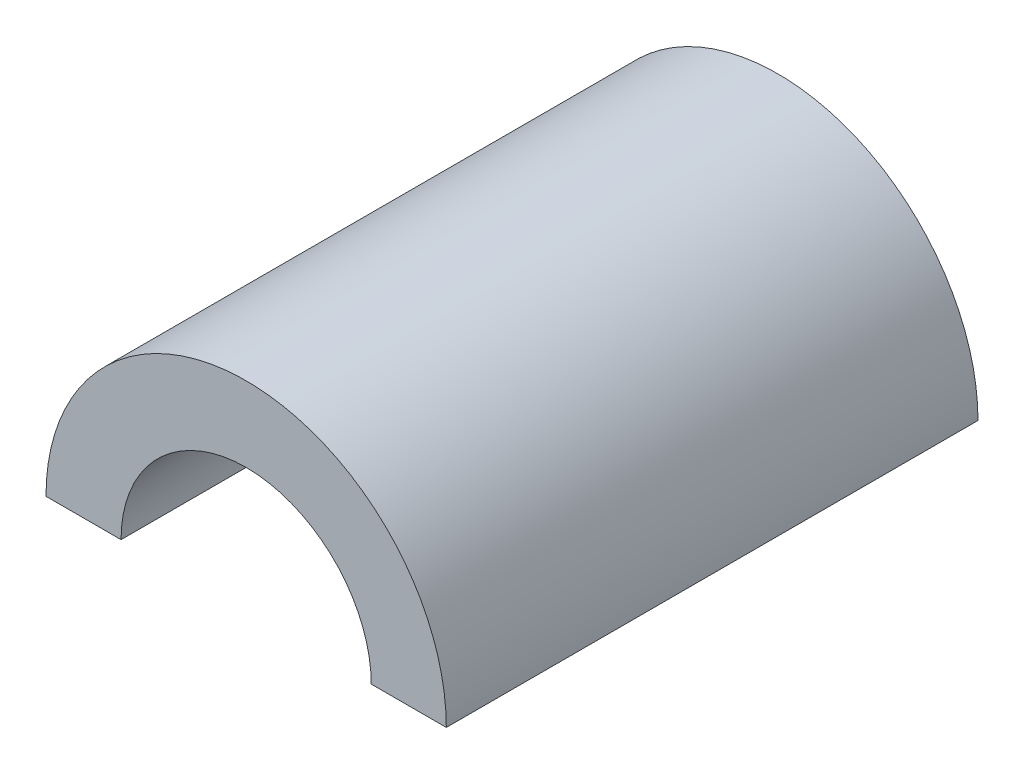
ISO-10303-21;
HEADER;
FILE_DESCRIPTION(('STEP AP214'),'2;1');
FILE_NAME('part.step','',(''),(''),'','','');
FILE_SCHEMA(('AUTOMOTIVE_DESIGN { 1 0 10303 214 1 1 1 1 }'));
ENDSEC;
DATA;
#1=APPLICATION_CONTEXT('core data for automotive mechanical design processes');
#2=APPLICATION_PROTOCOL_DEFINITION('international standard','automotive_design',2000,#1);
#3=PRODUCT_CONTEXT('',#1,'mechanical');
#4=PRODUCT('Part','Part','',(#3));
#5=PRODUCT_RELATED_PRODUCT_CATEGORY('part','',(#4));
#6=PRODUCT_DEFINITION_FORMATION('','',#4);
#7=PRODUCT_DEFINITION_CONTEXT('part definition',#1,'design');
#8=PRODUCT_DEFINITION('design','',#6,#7);
#9=PRODUCT_DEFINITION_SHAPE('','',#8);
#10=(LENGTH_UNIT() NAMED_UNIT(*) SI_UNIT(.MILLI.,.METRE.));
#11=(NAMED_UNIT(*) PLANE_ANGLE_UNIT() SI_UNIT($,.RADIAN.));
#12=(NAMED_UNIT(*) SI_UNIT($,.STERADIAN.) SOLID_ANGLE_UNIT());
#13=UNCERTAINTY_MEASURE_WITH_UNIT(LENGTH_MEASURE(1.E-05),#10,'distance_accuracy_value','');
#14=(GEOMETRIC_REPRESENTATION_CONTEXT(3) GLOBAL_UNCERTAINTY_ASSIGNED_CONTEXT((#13)) GLOBAL_UNIT_ASSIGNED_CONTEXT((#10,
#11,#12)) REPRESENTATION_CONTEXT('',''));
#15=CARTESIAN_POINT('',(0.,0.,0.));
#16=DIRECTION('',(0.,0.,1.));
#17=DIRECTION('',(1.,0.,0.));
#18=AXIS2_PLACEMENT_3D('',#15,#16,#17);
#19=CARTESIAN_POINT('',(32.,0.,-85.));
#20=DIRECTION('',(0.,0.,1.));
#21=DIRECTION('',(1.,0.,0.));
#22=AXIS2_PLACEMENT_3D('',#19,#20,#21);
#23=CYLINDRICAL_SURFACE('',#22,20.);
#24=CARTESIAN_POINT('',(32.,0.,0.));
#25=DIRECTION('',(0.,0.,1.));
#26=DIRECTION('',(1.,0.,0.));
#27=AXIS2_PLACEMENT_3D('',#24,#25,#26);
#28=CIRCLE('',#27,20.);
#29=CARTESIAN_POINT('',(12.,0.,0.));
#30=VERTEX_POINT('',#29);
#31=CARTESIAN_POINT('',(52.,0.,0.));
#32=VERTEX_POINT('',#31);
#33=EDGE_CURVE('E98',#30,#32,#28,.F.);
#34=ORIENTED_EDGE('',*,*,#33,.F.);
#35=DIRECTION('',(0.,0.,1.));
#36=VECTOR('',#35,1.);
#37=CARTESIAN_POINT('',(12.,0.,-85.));
#38=LINE('',#37,#36);
#39=CARTESIAN_POINT('',(12.,0.,-85.));
#40=VERTEX_POINT('',#39);
#41=EDGE_CURVE('E11',#40,#30,#38,.T.);
#42=ORIENTED_EDGE('',*,*,#41,.F.);
#43=CARTESIAN_POINT('',(32.,0.,-85.));
#44=DIRECTION('',(0.,0.,1.));
#45=DIRECTION('',(1.,0.,0.));
#46=AXIS2_PLACEMENT_3D('',#43,#44,#45);
#47=CIRCLE('',#46,20.);
#48=CARTESIAN_POINT('',(52.,0.,-85.));
#49=VERTEX_POINT('',#48);
#50=EDGE_CURVE('E93',#40,#49,#47,.F.);
#51=ORIENTED_EDGE('',*,*,#50,.T.);
#52=DIRECTION('',(0.,0.,1.));
#53=VECTOR('',#52,1.);
#54=CARTESIAN_POINT('',(52.,0.,-85.));
#55=LINE('',#54,#53);
#56=EDGE_CURVE('E36',#49,#32,#55,.T.);
#57=ORIENTED_EDGE('',*,*,#56,.T.);
#58=EDGE_LOOP('',(#34,#42,#51,#57));
#59=FACE_BOUND('',#58,.T.);
#60=ADVANCED_FACE('F33',(#59),#23,.F.);
#61=CARTESIAN_POINT('',(12.,0.,-85.));
#62=DIRECTION('',(0.,1.,0.));
#63=DIRECTION('',(-1.,0.,0.));
#64=AXIS2_PLACEMENT_3D('',#61,#62,#63);
#65=PLANE('',#64);
#66=DIRECTION('',(-1.,0.,0.));
#67=VECTOR('',#66,1.);
#68=CARTESIAN_POINT('',(12.,0.,0.));
#69=LINE('',#68,#67);
#70=CARTESIAN_POINT('',(0.,0.,0.));
#71=VERTEX_POINT('',#70);
#72=EDGE_CURVE('E66',#30,#71,#69,.T.);
#73=ORIENTED_EDGE('',*,*,#72,.T.);
#74=DIRECTION('',(0.,0.,1.));
#75=VECTOR('',#74,1.);
#76=CARTESIAN_POINT('',(0.,0.,-85.));
#77=LINE('',#76,#75);
#78=CARTESIAN_POINT('',(0.,0.,-85.));
#79=VERTEX_POINT('',#78);
#80=EDGE_CURVE('E42',#79,#71,#77,.T.);
#81=ORIENTED_EDGE('',*,*,#80,.F.);
#82=DIRECTION('',(-1.,0.,0.));
#83=VECTOR('',#82,1.);
#84=CARTESIAN_POINT('',(12.,0.,-85.));
#85=LINE('',#84,#83);
#86=EDGE_CURVE('E81',#40,#79,#85,.T.);
#87=ORIENTED_EDGE('',*,*,#86,.F.);
#88=ORIENTED_EDGE('',*,*,#41,.T.);
#89=EDGE_LOOP('',(#73,#81,#87,#88));
#90=FACE_BOUND('',#89,.T.);
#91=ADVANCED_FACE('F108',(#90),#65,.F.);
#92=CARTESIAN_POINT('',(32.,0.,-85.));
#93=DIRECTION('',(0.,0.,1.));
#94=DIRECTION('',(1.,0.,0.));
#95=AXIS2_PLACEMENT_3D('',#92,#93,#94);
#96=CYLINDRICAL_SURFACE('',#95,32.);
#97=CARTESIAN_POINT('',(32.,0.,0.));
#98=DIRECTION('',(0.,0.,-1.));
#99=DIRECTION('',(-1.,0.,0.));
#100=AXIS2_PLACEMENT_3D('',#97,#98,#99);
#101=CIRCLE('',#100,32.);
#102=CARTESIAN_POINT('',(64.,0.,0.));
#103=VERTEX_POINT('',#102);
#104=EDGE_CURVE('E88',#71,#103,#101,.T.);
#105=ORIENTED_EDGE('',*,*,#104,.T.);
#106=DIRECTION('',(0.,0.,1.));
#107=VECTOR('',#106,1.);
#108=CARTESIAN_POINT('',(64.,0.,-85.));
#109=LINE('',#108,#107);
#110=CARTESIAN_POINT('',(64.,0.,-85.));
#111=VERTEX_POINT('',#110);
#112=EDGE_CURVE('E85',#111,#103,#109,.T.);
#113=ORIENTED_EDGE('',*,*,#112,.F.);
#114=CARTESIAN_POINT('',(32.,0.,-85.));
#115=DIRECTION('',(0.,0.,-1.));
#116=DIRECTION('',(-1.,0.,0.));
#117=AXIS2_PLACEMENT_3D('',#114,#115,#116);
#118=CIRCLE('',#117,32.);
#119=EDGE_CURVE('E78',#79,#111,#118,.T.);
#120=ORIENTED_EDGE('',*,*,#119,.F.);
#121=ORIENTED_EDGE('',*,*,#80,.T.);
#122=EDGE_LOOP('',(#105,#113,#120,#121));
#123=FACE_BOUND('',#122,.T.);
#124=ADVANCED_FACE('F86',(#123),#96,.T.);
#125=CARTESIAN_POINT('',(64.,0.,-85.));
#126=DIRECTION('',(0.,1.,0.));
#127=DIRECTION('',(-1.,0.,0.));
#128=AXIS2_PLACEMENT_3D('',#125,#126,#127);
#129=PLANE('',#128);
#130=DIRECTION('',(-1.,0.,0.));
#131=VECTOR('',#130,1.);
#132=CARTESIAN_POINT('',(64.,0.,0.));
#133=LINE('',#132,#131);
#134=EDGE_CURVE('E101',#103,#32,#133,.T.);
#135=ORIENTED_EDGE('',*,*,#134,.T.);
#136=ORIENTED_EDGE('',*,*,#56,.F.);
#137=DIRECTION('',(-1.,0.,0.));
#138=VECTOR('',#137,1.);
#139=CARTESIAN_POINT('',(64.,0.,-85.));
#140=LINE('',#139,#138);
#141=EDGE_CURVE('E75',#111,#49,#140,.T.);
#142=ORIENTED_EDGE('',*,*,#141,.F.);
#143=ORIENTED_EDGE('',*,*,#112,.T.);
#144=EDGE_LOOP('',(#135,#136,#142,#143));
#145=FACE_BOUND('',#144,.T.);
#146=ADVANCED_FACE('F92',(#145),#129,.F.);
#147=CARTESIAN_POINT('',(32.,0.,-85.));
#148=DIRECTION('',(0.,0.,1.));
#149=DIRECTION('',(1.,0.,0.));
#150=AXIS2_PLACEMENT_3D('',#147,#148,#149);
#151=PLANE('',#150);
#152=ORIENTED_EDGE('',*,*,#50,.F.);
#153=ORIENTED_EDGE('',*,*,#86,.T.);
#154=ORIENTED_EDGE('',*,*,#119,.T.);
#155=ORIENTED_EDGE('',*,*,#141,.T.);
#156=EDGE_LOOP('',(#152,#153,#154,#155));
#157=FACE_BOUND('',#156,.T.);
#158=ADVANCED_FACE('F80',(#157),#151,.F.);
#159=CARTESIAN_POINT('',(32.,0.,0.));
#160=DIRECTION('',(0.,0.,1.));
#161=DIRECTION('',(1.,0.,0.));
#162=AXIS2_PLACEMENT_3D('',#159,#160,#161);
#163=PLANE('',#162);
#164=ORIENTED_EDGE('',*,*,#33,.T.);
#165=ORIENTED_EDGE('',*,*,#134,.F.);
#166=ORIENTED_EDGE('',*,*,#104,.F.);
#167=ORIENTED_EDGE('',*,*,#72,.F.);
#168=EDGE_LOOP('',(#164,#165,#166,#167));
#169=FACE_BOUND('',#168,.T.);
#170=ADVANCED_FACE('F106',(#169),#163,.T.);
#171=CLOSED_SHELL('',(#60,#91,#124,#146,#158,#170));
#172=MANIFOLD_SOLID_BREP('B2',#171);
#173=ADVANCED_BREP_SHAPE_REPRESENTATION('',(#18,#172),#14);
#174=SHAPE_DEFINITION_REPRESENTATION(#9,#173);
ENDSEC;
END-ISO-10303-21;
